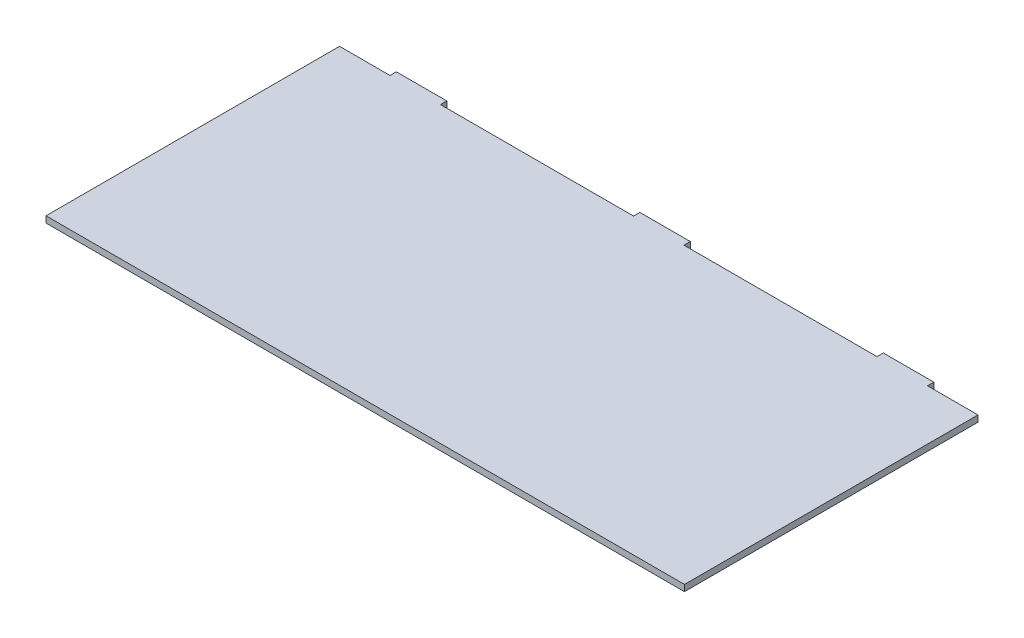
ISO-10303-21;
HEADER;
FILE_DESCRIPTION(('STEP AP214'),'2;1');
FILE_NAME('part.step','',(''),(''),'','','');
FILE_SCHEMA(('AUTOMOTIVE_DESIGN { 1 0 10303 214 1 1 1 1 }'));
ENDSEC;
DATA;
#1=APPLICATION_CONTEXT('core data for automotive mechanical design processes');
#2=APPLICATION_PROTOCOL_DEFINITION('international standard','automotive_design',2000,#1);
#3=PRODUCT_CONTEXT('',#1,'mechanical');
#4=PRODUCT('Part','Part','',(#3));
#5=PRODUCT_RELATED_PRODUCT_CATEGORY('part','',(#4));
#6=PRODUCT_DEFINITION_FORMATION('','',#4);
#7=PRODUCT_DEFINITION_CONTEXT('part definition',#1,'design');
#8=PRODUCT_DEFINITION('design','',#6,#7);
#9=PRODUCT_DEFINITION_SHAPE('','',#8);
#10=(LENGTH_UNIT() NAMED_UNIT(*) SI_UNIT(.MILLI.,.METRE.));
#11=(NAMED_UNIT(*) PLANE_ANGLE_UNIT() SI_UNIT($,.RADIAN.));
#12=(NAMED_UNIT(*) SI_UNIT($,.STERADIAN.) SOLID_ANGLE_UNIT());
#13=UNCERTAINTY_MEASURE_WITH_UNIT(LENGTH_MEASURE(1.E-05),#10,'distance_accuracy_value','');
#14=(GEOMETRIC_REPRESENTATION_CONTEXT(3) GLOBAL_UNCERTAINTY_ASSIGNED_CONTEXT((#13)) GLOBAL_UNIT_ASSIGNED_CONTEXT((#10,
#11,#12)) REPRESENTATION_CONTEXT('',''));
#15=CARTESIAN_POINT('',(0.,0.,0.));
#16=DIRECTION('',(0.,0.,1.));
#17=DIRECTION('',(1.,0.,0.));
#18=AXIS2_PLACEMENT_3D('',#15,#16,#17);
#19=CARTESIAN_POINT('',(0.,3.175,-147.69846));
#20=DIRECTION('',(0.,0.,1.));
#21=DIRECTION('',(1.,0.,0.));
#22=AXIS2_PLACEMENT_3D('',#19,#20,#21);
#23=PLANE('',#22);
#24=DIRECTION('',(0.,-1.,0.));
#25=VECTOR('',#24,1.);
#26=CARTESIAN_POINT('',(50.8000000000002,3.175,-147.69846));
#27=LINE('',#26,#25);
#28=CARTESIAN_POINT('',(50.8000000000002,3.175,-147.69846));
#29=VERTEX_POINT('',#28);
#30=CARTESIAN_POINT('',(50.8000000000002,0.,-147.69846));
#31=VERTEX_POINT('',#30);
#32=EDGE_CURVE('E59',#29,#31,#27,.T.);
#33=ORIENTED_EDGE('',*,*,#32,.F.);
#34=DIRECTION('',(-1.,0.,0.));
#35=VECTOR('',#34,1.);
#36=CARTESIAN_POINT('',(0.,3.175,-147.69846));
#37=LINE('',#36,#35);
#38=CARTESIAN_POINT('',(147.920709999998,3.175,-147.69846));
#39=VERTEX_POINT('',#38);
#40=EDGE_CURVE('E300',#39,#29,#37,.T.);
#41=ORIENTED_EDGE('',*,*,#40,.F.);
#42=DIRECTION('',(0.,1.,0.));
#43=VECTOR('',#42,1.);
#44=CARTESIAN_POINT('',(147.920709999998,3.175,-147.69846));
#45=LINE('',#44,#43);
#46=CARTESIAN_POINT('',(147.920709999998,0.,-147.69846));
#47=VERTEX_POINT('',#46);
#48=EDGE_CURVE('E176',#47,#39,#45,.T.);
#49=ORIENTED_EDGE('',*,*,#48,.F.);
#50=DIRECTION('',(-1.,0.,0.));
#51=VECTOR('',#50,1.);
#52=CARTESIAN_POINT('',(0.,0.,-147.69846));
#53=LINE('',#52,#51);
#54=EDGE_CURVE('E292',#47,#31,#53,.T.);
#55=ORIENTED_EDGE('',*,*,#54,.T.);
#56=EDGE_LOOP('',(#33,#41,#49,#55));
#57=FACE_BOUND('',#56,.T.);
#58=ADVANCED_FACE('F36',(#57),#23,.F.);
#59=DIRECTION('',(0.,1.,0.));
#60=VECTOR('',#59,1.);
#61=CARTESIAN_POINT('',(25.4000000000002,3.175,-147.69846));
#62=LINE('',#61,#60);
#63=CARTESIAN_POINT('',(25.4000000000002,0.,-147.69846));
#64=VERTEX_POINT('',#63);
#65=CARTESIAN_POINT('',(25.4000000000002,3.175,-147.69846));
#66=VERTEX_POINT('',#65);
#67=EDGE_CURVE('E170',#64,#66,#62,.T.);
#68=ORIENTED_EDGE('',*,*,#67,.F.);
#69=CARTESIAN_POINT('',(0.,0.,-147.69846));
#70=VERTEX_POINT('',#69);
#71=EDGE_CURVE('E252',#64,#70,#53,.T.);
#72=ORIENTED_EDGE('',*,*,#71,.T.);
#73=DIRECTION('',(0.,-1.,0.));
#74=VECTOR('',#73,1.);
#75=CARTESIAN_POINT('',(0.,3.175,-147.69846));
#76=LINE('',#75,#74);
#77=CARTESIAN_POINT('',(0.,3.175,-147.69846));
#78=VERTEX_POINT('',#77);
#79=EDGE_CURVE('E244',#78,#70,#76,.T.);
#80=ORIENTED_EDGE('',*,*,#79,.F.);
#81=EDGE_CURVE('E51',#66,#78,#37,.T.);
#82=ORIENTED_EDGE('',*,*,#81,.F.);
#83=EDGE_LOOP('',(#68,#72,#80,#82));
#84=FACE_BOUND('',#83,.T.);
#85=ADVANCED_FACE('F294',(#84),#23,.F.);
#86=DIRECTION('',(0.,-1.,0.));
#87=VECTOR('',#86,1.);
#88=CARTESIAN_POINT('',(173.320709999998,3.175,-147.69846));
#89=LINE('',#88,#87);
#90=CARTESIAN_POINT('',(173.320709999998,3.175,-147.69846));
#91=VERTEX_POINT('',#90);
#92=CARTESIAN_POINT('',(173.320709999998,0.,-147.69846));
#93=VERTEX_POINT('',#92);
#94=EDGE_CURVE('E173',#91,#93,#89,.T.);
#95=ORIENTED_EDGE('',*,*,#94,.F.);
#96=CARTESIAN_POINT('',(270.44142,3.175,-147.69846));
#97=VERTEX_POINT('',#96);
#98=EDGE_CURVE('E245',#97,#91,#37,.T.);
#99=ORIENTED_EDGE('',*,*,#98,.F.);
#100=DIRECTION('',(0.,1.,0.));
#101=VECTOR('',#100,1.);
#102=CARTESIAN_POINT('',(270.44142,3.175,-147.69846));
#103=LINE('',#102,#101);
#104=CARTESIAN_POINT('',(270.44142,0.,-147.69846));
#105=VERTEX_POINT('',#104);
#106=EDGE_CURVE('E210',#105,#97,#103,.T.);
#107=ORIENTED_EDGE('',*,*,#106,.F.);
#108=EDGE_CURVE('E254',#105,#93,#53,.T.);
#109=ORIENTED_EDGE('',*,*,#108,.T.);
#110=EDGE_LOOP('',(#95,#99,#107,#109));
#111=FACE_BOUND('',#110,.T.);
#112=ADVANCED_FACE('F290',(#111),#23,.F.);
#113=DIRECTION('',(0.,-1.,0.));
#114=VECTOR('',#113,1.);
#115=CARTESIAN_POINT('',(295.84142,3.175,-147.69846));
#116=LINE('',#115,#114);
#117=CARTESIAN_POINT('',(295.84142,3.175,-147.69846));
#118=VERTEX_POINT('',#117);
#119=CARTESIAN_POINT('',(295.84142,0.,-147.69846));
#120=VERTEX_POINT('',#119);
#121=EDGE_CURVE('E205',#118,#120,#116,.T.);
#122=ORIENTED_EDGE('',*,*,#121,.F.);
#123=CARTESIAN_POINT('',(321.24142,3.175,-147.69846));
#124=VERTEX_POINT('',#123);
#125=EDGE_CURVE('E241',#124,#118,#37,.T.);
#126=ORIENTED_EDGE('',*,*,#125,.F.);
#127=DIRECTION('',(0.,-1.,0.));
#128=VECTOR('',#127,1.);
#129=CARTESIAN_POINT('',(321.24142,3.175,-147.69846));
#130=LINE('',#129,#128);
#131=CARTESIAN_POINT('',(321.24142,0.,-147.69846));
#132=VERTEX_POINT('',#131);
#133=EDGE_CURVE('E257',#124,#132,#130,.T.);
#134=ORIENTED_EDGE('',*,*,#133,.T.);
#135=EDGE_CURVE('E237',#132,#120,#53,.T.);
#136=ORIENTED_EDGE('',*,*,#135,.T.);
#137=EDGE_LOOP('',(#122,#126,#134,#136));
#138=FACE_BOUND('',#137,.T.);
#139=ADVANCED_FACE('F270',(#138),#23,.F.);
#140=CARTESIAN_POINT('',(0.,3.175,0.));
#141=DIRECTION('',(1.,0.,0.));
#142=DIRECTION('',(0.,0.,-1.));
#143=AXIS2_PLACEMENT_3D('',#140,#141,#142);
#144=PLANE('',#143);
#145=DIRECTION('',(0.,0.,1.));
#146=VECTOR('',#145,1.);
#147=CARTESIAN_POINT('',(0.,0.,0.));
#148=LINE('',#147,#146);
#149=CARTESIAN_POINT('',(0.,0.,0.));
#150=VERTEX_POINT('',#149);
#151=EDGE_CURVE('E232',#70,#150,#148,.T.);
#152=ORIENTED_EDGE('',*,*,#151,.T.);
#153=DIRECTION('',(0.,-1.,0.));
#154=VECTOR('',#153,1.);
#155=CARTESIAN_POINT('',(0.,3.175,0.));
#156=LINE('',#155,#154);
#157=CARTESIAN_POINT('',(0.,3.175,0.));
#158=VERTEX_POINT('',#157);
#159=EDGE_CURVE('E11',#158,#150,#156,.T.);
#160=ORIENTED_EDGE('',*,*,#159,.F.);
#161=DIRECTION('',(0.,0.,1.));
#162=VECTOR('',#161,1.);
#163=CARTESIAN_POINT('',(0.,3.175,0.));
#164=LINE('',#163,#162);
#165=EDGE_CURVE('E233',#78,#158,#164,.T.);
#166=ORIENTED_EDGE('',*,*,#165,.F.);
#167=ORIENTED_EDGE('',*,*,#79,.T.);
#168=EDGE_LOOP('',(#152,#160,#166,#167));
#169=FACE_BOUND('',#168,.T.);
#170=ADVANCED_FACE('F38',(#169),#144,.F.);
#171=CARTESIAN_POINT('',(0.,3.175,0.));
#172=DIRECTION('',(0.,0.,-1.));
#173=DIRECTION('',(-1.,0.,0.));
#174=AXIS2_PLACEMENT_3D('',#171,#172,#173);
#175=PLANE('',#174);
#176=DIRECTION('',(1.,0.,0.));
#177=VECTOR('',#176,1.);
#178=CARTESIAN_POINT('',(0.,0.,0.));
#179=LINE('',#178,#177);
#180=CARTESIAN_POINT('',(321.24142,0.,0.));
#181=VERTEX_POINT('',#180);
#182=EDGE_CURVE('E248',#150,#181,#179,.T.);
#183=ORIENTED_EDGE('',*,*,#182,.T.);
#184=DIRECTION('',(0.,-1.,0.));
#185=VECTOR('',#184,1.);
#186=CARTESIAN_POINT('',(321.24142,3.175,0.));
#187=LINE('',#186,#185);
#188=CARTESIAN_POINT('',(321.24142,3.175,0.));
#189=VERTEX_POINT('',#188);
#190=EDGE_CURVE('E44',#189,#181,#187,.T.);
#191=ORIENTED_EDGE('',*,*,#190,.F.);
#192=DIRECTION('',(1.,0.,0.));
#193=VECTOR('',#192,1.);
#194=CARTESIAN_POINT('',(0.,3.175,0.));
#195=LINE('',#194,#193);
#196=EDGE_CURVE('E236',#158,#189,#195,.T.);
#197=ORIENTED_EDGE('',*,*,#196,.F.);
#198=ORIENTED_EDGE('',*,*,#159,.T.);
#199=EDGE_LOOP('',(#183,#191,#197,#198));
#200=FACE_BOUND('',#199,.T.);
#201=ADVANCED_FACE('F332',(#200),#175,.F.);
#202=CARTESIAN_POINT('',(321.24142,3.175,0.));
#203=DIRECTION('',(-1.,0.,0.));
#204=DIRECTION('',(0.,0.,1.));
#205=AXIS2_PLACEMENT_3D('',#202,#203,#204);
#206=PLANE('',#205);
#207=DIRECTION('',(0.,0.,-1.));
#208=VECTOR('',#207,1.);
#209=CARTESIAN_POINT('',(321.24142,0.,0.));
#210=LINE('',#209,#208);
#211=EDGE_CURVE('E250',#181,#132,#210,.T.);
#212=ORIENTED_EDGE('',*,*,#211,.T.);
#213=ORIENTED_EDGE('',*,*,#133,.F.);
#214=DIRECTION('',(0.,0.,-1.));
#215=VECTOR('',#214,1.);
#216=CARTESIAN_POINT('',(321.24142,3.175,0.));
#217=LINE('',#216,#215);
#218=EDGE_CURVE('E239',#189,#124,#217,.T.);
#219=ORIENTED_EDGE('',*,*,#218,.F.);
#220=ORIENTED_EDGE('',*,*,#190,.T.);
#221=EDGE_LOOP('',(#212,#213,#219,#220));
#222=FACE_BOUND('',#221,.T.);
#223=ADVANCED_FACE('F264',(#222),#206,.F.);
#224=CARTESIAN_POINT('',(0.,3.175,0.));
#225=DIRECTION('',(0.,-1.,0.));
#226=DIRECTION('',(0.,0.,-1.));
#227=AXIS2_PLACEMENT_3D('',#224,#225,#226);
#228=PLANE('',#227);
#229=ORIENTED_EDGE('',*,*,#165,.T.);
#230=ORIENTED_EDGE('',*,*,#196,.T.);
#231=ORIENTED_EDGE('',*,*,#218,.T.);
#232=ORIENTED_EDGE('',*,*,#125,.T.);
#233=DIRECTION('',(0.,0.,1.));
#234=VECTOR('',#233,1.);
#235=CARTESIAN_POINT('',(295.84142,3.175,-150.87346));
#236=LINE('',#235,#234);
#237=CARTESIAN_POINT('',(295.84142,3.175,-150.87346));
#238=VERTEX_POINT('',#237);
#239=EDGE_CURVE('E216',#238,#118,#236,.T.);
#240=ORIENTED_EDGE('',*,*,#239,.F.);
#241=DIRECTION('',(1.,0.,0.));
#242=VECTOR('',#241,1.);
#243=CARTESIAN_POINT('',(295.84142,3.175,-150.87346));
#244=LINE('',#243,#242);
#245=CARTESIAN_POINT('',(270.44142,3.175,-150.87346));
#246=VERTEX_POINT('',#245);
#247=EDGE_CURVE('E214',#246,#238,#244,.T.);
#248=ORIENTED_EDGE('',*,*,#247,.F.);
#249=DIRECTION('',(0.,0.,1.));
#250=VECTOR('',#249,1.);
#251=CARTESIAN_POINT('',(270.44142,3.175,-150.87346));
#252=LINE('',#251,#250);
#253=EDGE_CURVE('E223',#246,#97,#252,.T.);
#254=ORIENTED_EDGE('',*,*,#253,.T.);
#255=ORIENTED_EDGE('',*,*,#98,.T.);
#256=DIRECTION('',(0.,0.,1.));
#257=VECTOR('',#256,1.);
#258=CARTESIAN_POINT('',(173.320709999998,3.175,-150.87346));
#259=LINE('',#258,#257);
#260=CARTESIAN_POINT('',(173.320709999998,3.175,-150.87346));
#261=VERTEX_POINT('',#260);
#262=EDGE_CURVE('E190',#261,#91,#259,.T.);
#263=ORIENTED_EDGE('',*,*,#262,.F.);
#264=DIRECTION('',(1.,0.,0.));
#265=VECTOR('',#264,1.);
#266=CARTESIAN_POINT('',(173.320709999998,3.175,-150.87346));
#267=LINE('',#266,#265);
#268=CARTESIAN_POINT('',(147.920709999998,3.175,-150.87346));
#269=VERTEX_POINT('',#268);
#270=EDGE_CURVE('E189',#269,#261,#267,.T.);
#271=ORIENTED_EDGE('',*,*,#270,.F.);
#272=DIRECTION('',(0.,0.,1.));
#273=VECTOR('',#272,1.);
#274=CARTESIAN_POINT('',(147.920709999998,3.175,-150.87346));
#275=LINE('',#274,#273);
#276=EDGE_CURVE('E196',#269,#39,#275,.T.);
#277=ORIENTED_EDGE('',*,*,#276,.T.);
#278=ORIENTED_EDGE('',*,*,#40,.T.);
#279=DIRECTION('',(0.,0.,1.));
#280=VECTOR('',#279,1.);
#281=CARTESIAN_POINT('',(50.8000000000002,3.175,-150.87346));
#282=LINE('',#281,#280);
#283=CARTESIAN_POINT('',(50.8000000000002,3.175,-150.87346));
#284=VERTEX_POINT('',#283);
#285=EDGE_CURVE('E301',#284,#29,#282,.T.);
#286=ORIENTED_EDGE('',*,*,#285,.F.);
#287=DIRECTION('',(1.,0.,0.));
#288=VECTOR('',#287,1.);
#289=CARTESIAN_POINT('',(50.8000000000002,3.175,-150.87346));
#290=LINE('',#289,#288);
#291=CARTESIAN_POINT('',(25.4000000000002,3.175,-150.87346));
#292=VERTEX_POINT('',#291);
#293=EDGE_CURVE('E166',#292,#284,#290,.T.);
#294=ORIENTED_EDGE('',*,*,#293,.F.);
#295=DIRECTION('',(0.,0.,1.));
#296=VECTOR('',#295,1.);
#297=CARTESIAN_POINT('',(25.4000000000002,3.175,-150.87346));
#298=LINE('',#297,#296);
#299=EDGE_CURVE('E178',#292,#66,#298,.T.);
#300=ORIENTED_EDGE('',*,*,#299,.T.);
#301=ORIENTED_EDGE('',*,*,#81,.T.);
#302=EDGE_LOOP('',(#229,#230,#231,#232,#240,#248,#254,#255,#263,#271,#277,#278,#286,#294,#300,#301));
#303=FACE_BOUND('',#302,.T.);
#304=ADVANCED_FACE('F274',(#303),#228,.F.);
#305=CARTESIAN_POINT('',(0.,0.,0.));
#306=DIRECTION('',(0.,-1.,0.));
#307=DIRECTION('',(0.,0.,-1.));
#308=AXIS2_PLACEMENT_3D('',#305,#306,#307);
#309=PLANE('',#308);
#310=ORIENTED_EDGE('',*,*,#151,.F.);
#311=ORIENTED_EDGE('',*,*,#71,.F.);
#312=DIRECTION('',(0.,0.,1.));
#313=VECTOR('',#312,1.);
#314=CARTESIAN_POINT('',(25.4000000000002,0.,-150.87346));
#315=LINE('',#314,#313);
#316=CARTESIAN_POINT('',(25.4000000000002,0.,-150.87346));
#317=VERTEX_POINT('',#316);
#318=EDGE_CURVE('E157',#317,#64,#315,.T.);
#319=ORIENTED_EDGE('',*,*,#318,.F.);
#320=DIRECTION('',(-1.,0.,0.));
#321=VECTOR('',#320,1.);
#322=CARTESIAN_POINT('',(50.8000000000002,0.,-150.87346));
#323=LINE('',#322,#321);
#324=CARTESIAN_POINT('',(50.8000000000002,0.,-150.87346));
#325=VERTEX_POINT('',#324);
#326=EDGE_CURVE('E150',#325,#317,#323,.T.);
#327=ORIENTED_EDGE('',*,*,#326,.F.);
#328=DIRECTION('',(0.,0.,1.));
#329=VECTOR('',#328,1.);
#330=CARTESIAN_POINT('',(50.8000000000002,0.,-150.87346));
#331=LINE('',#330,#329);
#332=EDGE_CURVE('E155',#325,#31,#331,.T.);
#333=ORIENTED_EDGE('',*,*,#332,.T.);
#334=ORIENTED_EDGE('',*,*,#54,.F.);
#335=DIRECTION('',(0.,0.,1.));
#336=VECTOR('',#335,1.);
#337=CARTESIAN_POINT('',(147.920709999998,0.,-150.87346));
#338=LINE('',#337,#336);
#339=CARTESIAN_POINT('',(147.920709999998,0.,-150.87346));
#340=VERTEX_POINT('',#339);
#341=EDGE_CURVE('E199',#340,#47,#338,.T.);
#342=ORIENTED_EDGE('',*,*,#341,.F.);
#343=DIRECTION('',(-1.,0.,0.));
#344=VECTOR('',#343,1.);
#345=CARTESIAN_POINT('',(173.320709999998,0.,-150.87346));
#346=LINE('',#345,#344);
#347=CARTESIAN_POINT('',(173.320709999998,0.,-150.87346));
#348=VERTEX_POINT('',#347);
#349=EDGE_CURVE('E185',#348,#340,#346,.T.);
#350=ORIENTED_EDGE('',*,*,#349,.F.);
#351=DIRECTION('',(0.,0.,1.));
#352=VECTOR('',#351,1.);
#353=CARTESIAN_POINT('',(173.320709999998,0.,-150.87346));
#354=LINE('',#353,#352);
#355=EDGE_CURVE('E202',#348,#93,#354,.T.);
#356=ORIENTED_EDGE('',*,*,#355,.T.);
#357=ORIENTED_EDGE('',*,*,#108,.F.);
#358=DIRECTION('',(0.,0.,1.));
#359=VECTOR('',#358,1.);
#360=CARTESIAN_POINT('',(270.44142,0.,-150.87346));
#361=LINE('',#360,#359);
#362=CARTESIAN_POINT('',(270.44142,0.,-150.87346));
#363=VERTEX_POINT('',#362);
#364=EDGE_CURVE('E226',#363,#105,#361,.T.);
#365=ORIENTED_EDGE('',*,*,#364,.F.);
#366=DIRECTION('',(-1.,0.,0.));
#367=VECTOR('',#366,1.);
#368=CARTESIAN_POINT('',(295.84142,0.,-150.87346));
#369=LINE('',#368,#367);
#370=CARTESIAN_POINT('',(295.84142,0.,-150.87346));
#371=VERTEX_POINT('',#370);
#372=EDGE_CURVE('E209',#371,#363,#369,.T.);
#373=ORIENTED_EDGE('',*,*,#372,.F.);
#374=DIRECTION('',(0.,0.,1.));
#375=VECTOR('',#374,1.);
#376=CARTESIAN_POINT('',(295.84142,0.,-150.87346));
#377=LINE('',#376,#375);
#378=EDGE_CURVE('E229',#371,#120,#377,.T.);
#379=ORIENTED_EDGE('',*,*,#378,.T.);
#380=ORIENTED_EDGE('',*,*,#135,.F.);
#381=ORIENTED_EDGE('',*,*,#211,.F.);
#382=ORIENTED_EDGE('',*,*,#182,.F.);
#383=EDGE_LOOP('',(#310,#311,#319,#327,#333,#334,#342,#350,#356,#357,#365,#373,#379,#380,#381,#382));
#384=FACE_BOUND('',#383,.T.);
#385=ADVANCED_FACE('F153',(#384),#309,.T.);
#386=CARTESIAN_POINT('',(295.84142,3.175,-150.87346));
#387=DIRECTION('',(-1.,0.,0.));
#388=DIRECTION('',(0.,0.,1.));
#389=AXIS2_PLACEMENT_3D('',#386,#387,#388);
#390=PLANE('',#389);
#391=ORIENTED_EDGE('',*,*,#121,.T.);
#392=ORIENTED_EDGE('',*,*,#378,.F.);
#393=DIRECTION('',(0.,-1.,0.));
#394=VECTOR('',#393,1.);
#395=CARTESIAN_POINT('',(295.84142,3.175,-150.87346));
#396=LINE('',#395,#394);
#397=EDGE_CURVE('E206',#238,#371,#396,.T.);
#398=ORIENTED_EDGE('',*,*,#397,.F.);
#399=ORIENTED_EDGE('',*,*,#239,.T.);
#400=EDGE_LOOP('',(#391,#392,#398,#399));
#401=FACE_BOUND('',#400,.T.);
#402=ADVANCED_FACE('F278',(#401),#390,.F.);
#403=CARTESIAN_POINT('',(270.44142,3.175,-150.87346));
#404=DIRECTION('',(1.,0.,0.));
#405=DIRECTION('',(0.,0.,-1.));
#406=AXIS2_PLACEMENT_3D('',#403,#404,#405);
#407=PLANE('',#406);
#408=ORIENTED_EDGE('',*,*,#106,.T.);
#409=ORIENTED_EDGE('',*,*,#253,.F.);
#410=DIRECTION('',(0.,1.,0.));
#411=VECTOR('',#410,1.);
#412=CARTESIAN_POINT('',(270.44142,3.175,-150.87346));
#413=LINE('',#412,#411);
#414=EDGE_CURVE('E212',#363,#246,#413,.T.);
#415=ORIENTED_EDGE('',*,*,#414,.F.);
#416=ORIENTED_EDGE('',*,*,#364,.T.);
#417=EDGE_LOOP('',(#408,#409,#415,#416));
#418=FACE_BOUND('',#417,.T.);
#419=ADVANCED_FACE('F287',(#418),#407,.F.);
#420=CARTESIAN_POINT('',(0.,0.,-150.87346));
#421=DIRECTION('',(0.,0.,-1.));
#422=DIRECTION('',(-1.,0.,0.));
#423=AXIS2_PLACEMENT_3D('',#420,#421,#422);
#424=PLANE('',#423);
#425=ORIENTED_EDGE('',*,*,#397,.T.);
#426=ORIENTED_EDGE('',*,*,#372,.T.);
#427=ORIENTED_EDGE('',*,*,#414,.T.);
#428=ORIENTED_EDGE('',*,*,#247,.T.);
#429=EDGE_LOOP('',(#425,#426,#427,#428));
#430=FACE_BOUND('',#429,.T.);
#431=ADVANCED_FACE('F280',(#430),#424,.T.);
#432=CARTESIAN_POINT('',(173.320709999998,3.175,-150.87346));
#433=DIRECTION('',(-1.,0.,0.));
#434=DIRECTION('',(0.,0.,1.));
#435=AXIS2_PLACEMENT_3D('',#432,#433,#434);
#436=PLANE('',#435);
#437=ORIENTED_EDGE('',*,*,#94,.T.);
#438=ORIENTED_EDGE('',*,*,#355,.F.);
#439=DIRECTION('',(0.,-1.,0.));
#440=VECTOR('',#439,1.);
#441=CARTESIAN_POINT('',(173.320709999998,3.175,-150.87346));
#442=LINE('',#441,#440);
#443=EDGE_CURVE('E182',#261,#348,#442,.T.);
#444=ORIENTED_EDGE('',*,*,#443,.F.);
#445=ORIENTED_EDGE('',*,*,#262,.T.);
#446=EDGE_LOOP('',(#437,#438,#444,#445));
#447=FACE_BOUND('',#446,.T.);
#448=ADVANCED_FACE('F396',(#447),#436,.F.);
#449=CARTESIAN_POINT('',(147.920709999998,3.175,-150.87346));
#450=DIRECTION('',(1.,0.,0.));
#451=DIRECTION('',(0.,0.,-1.));
#452=AXIS2_PLACEMENT_3D('',#449,#450,#451);
#453=PLANE('',#452);
#454=ORIENTED_EDGE('',*,*,#48,.T.);
#455=ORIENTED_EDGE('',*,*,#276,.F.);
#456=DIRECTION('',(0.,1.,0.));
#457=VECTOR('',#456,1.);
#458=CARTESIAN_POINT('',(147.920709999998,3.175,-150.87346));
#459=LINE('',#458,#457);
#460=EDGE_CURVE('E187',#340,#269,#459,.T.);
#461=ORIENTED_EDGE('',*,*,#460,.F.);
#462=ORIENTED_EDGE('',*,*,#341,.T.);
#463=EDGE_LOOP('',(#454,#455,#461,#462));
#464=FACE_BOUND('',#463,.T.);
#465=ADVANCED_FACE('F403',(#464),#453,.F.);
#466=CARTESIAN_POINT('',(0.,0.,-150.87346));
#467=DIRECTION('',(0.,0.,-1.));
#468=DIRECTION('',(-1.,0.,0.));
#469=AXIS2_PLACEMENT_3D('',#466,#467,#468);
#470=PLANE('',#469);
#471=ORIENTED_EDGE('',*,*,#443,.T.);
#472=ORIENTED_EDGE('',*,*,#349,.T.);
#473=ORIENTED_EDGE('',*,*,#460,.T.);
#474=ORIENTED_EDGE('',*,*,#270,.T.);
#475=EDGE_LOOP('',(#471,#472,#473,#474));
#476=FACE_BOUND('',#475,.T.);
#477=ADVANCED_FACE('F318',(#476),#470,.T.);
#478=CARTESIAN_POINT('',(50.8000000000002,3.175,-150.87346));
#479=DIRECTION('',(-1.,0.,0.));
#480=DIRECTION('',(0.,0.,1.));
#481=AXIS2_PLACEMENT_3D('',#478,#479,#480);
#482=PLANE('',#481);
#483=ORIENTED_EDGE('',*,*,#32,.T.);
#484=ORIENTED_EDGE('',*,*,#332,.F.);
#485=DIRECTION('',(0.,-1.,0.));
#486=VECTOR('',#485,1.);
#487=CARTESIAN_POINT('',(50.8000000000002,3.175,-150.87346));
#488=LINE('',#487,#486);
#489=EDGE_CURVE('E161',#284,#325,#488,.T.);
#490=ORIENTED_EDGE('',*,*,#489,.F.);
#491=ORIENTED_EDGE('',*,*,#285,.T.);
#492=EDGE_LOOP('',(#483,#484,#490,#491));
#493=FACE_BOUND('',#492,.T.);
#494=ADVANCED_FACE('F172',(#493),#482,.F.);
#495=CARTESIAN_POINT('',(25.4000000000002,3.175,-150.87346));
#496=DIRECTION('',(1.,0.,0.));
#497=DIRECTION('',(0.,0.,-1.));
#498=AXIS2_PLACEMENT_3D('',#495,#496,#497);
#499=PLANE('',#498);
#500=ORIENTED_EDGE('',*,*,#67,.T.);
#501=ORIENTED_EDGE('',*,*,#299,.F.);
#502=DIRECTION('',(0.,1.,0.));
#503=VECTOR('',#502,1.);
#504=CARTESIAN_POINT('',(25.4000000000002,3.175,-150.87346));
#505=LINE('',#504,#503);
#506=EDGE_CURVE('E160',#317,#292,#505,.T.);
#507=ORIENTED_EDGE('',*,*,#506,.F.);
#508=ORIENTED_EDGE('',*,*,#318,.T.);
#509=EDGE_LOOP('',(#500,#501,#507,#508));
#510=FACE_BOUND('',#509,.T.);
#511=ADVANCED_FACE('F310',(#510),#499,.F.);
#512=CARTESIAN_POINT('',(0.,0.,-150.87346));
#513=DIRECTION('',(0.,0.,-1.));
#514=DIRECTION('',(-1.,0.,0.));
#515=AXIS2_PLACEMENT_3D('',#512,#513,#514);
#516=PLANE('',#515);
#517=ORIENTED_EDGE('',*,*,#489,.T.);
#518=ORIENTED_EDGE('',*,*,#326,.T.);
#519=ORIENTED_EDGE('',*,*,#506,.T.);
#520=ORIENTED_EDGE('',*,*,#293,.T.);
#521=EDGE_LOOP('',(#517,#518,#519,#520));
#522=FACE_BOUND('',#521,.T.);
#523=ADVANCED_FACE('F164',(#522),#516,.T.);
#524=CLOSED_SHELL('',(#58,#85,#112,#139,#170,#201,#223,#304,#385,#402,#419,#431,#448,#465,#477,
#494,#511,#523));
#525=MANIFOLD_SOLID_BREP('B2',#524);
#526=ADVANCED_BREP_SHAPE_REPRESENTATION('',(#18,#525),#14);
#527=SHAPE_DEFINITION_REPRESENTATION(#9,#526);
ENDSEC;
END-ISO-10303-21;
